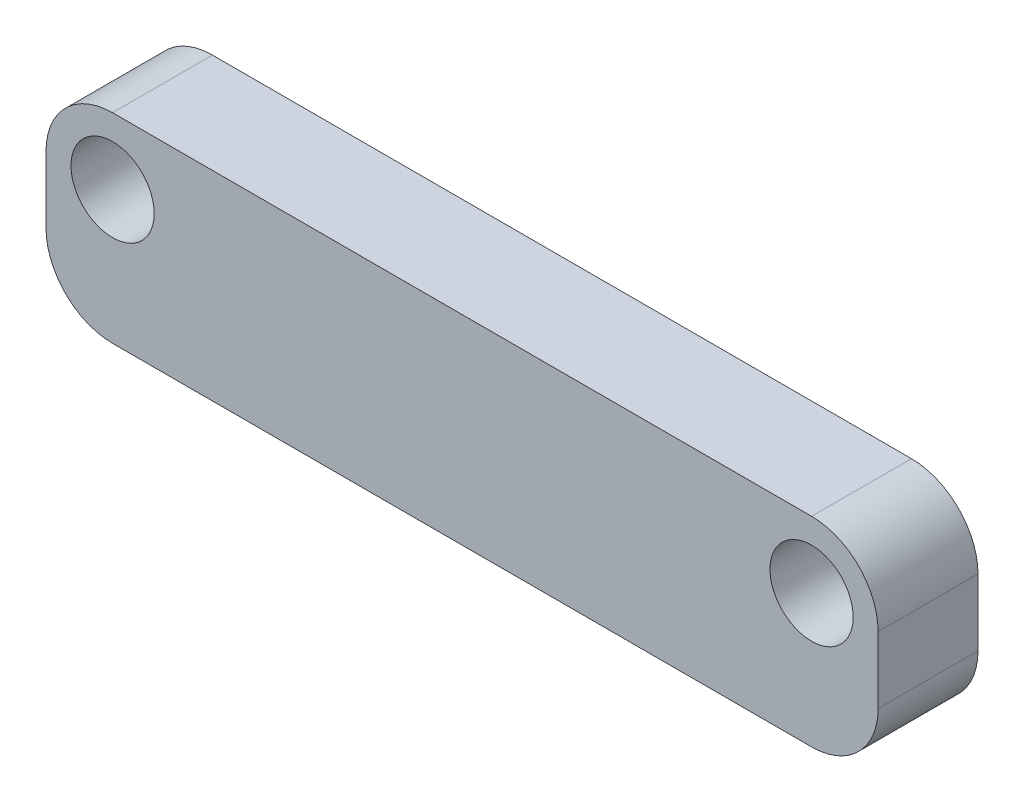
ISO-10303-21;
HEADER;
FILE_DESCRIPTION(('STEP AP214'),'2;1');
FILE_NAME('part.step','',(''),(''),'','','');
FILE_SCHEMA(('AUTOMOTIVE_DESIGN { 1 0 10303 214 1 1 1 1 }'));
ENDSEC;
DATA;
#1=APPLICATION_CONTEXT('core data for automotive mechanical design processes');
#2=APPLICATION_PROTOCOL_DEFINITION('international standard','automotive_design',2000,#1);
#3=PRODUCT_CONTEXT('',#1,'mechanical');
#4=PRODUCT('Part','Part','',(#3));
#5=PRODUCT_RELATED_PRODUCT_CATEGORY('part','',(#4));
#6=PRODUCT_DEFINITION_FORMATION('','',#4);
#7=PRODUCT_DEFINITION_CONTEXT('part definition',#1,'design');
#8=PRODUCT_DEFINITION('design','',#6,#7);
#9=PRODUCT_DEFINITION_SHAPE('','',#8);
#10=(LENGTH_UNIT() NAMED_UNIT(*) SI_UNIT(.MILLI.,.METRE.));
#11=(NAMED_UNIT(*) PLANE_ANGLE_UNIT() SI_UNIT($,.RADIAN.));
#12=(NAMED_UNIT(*) SI_UNIT($,.STERADIAN.) SOLID_ANGLE_UNIT());
#13=UNCERTAINTY_MEASURE_WITH_UNIT(LENGTH_MEASURE(1.E-05),#10,'distance_accuracy_value','');
#14=(GEOMETRIC_REPRESENTATION_CONTEXT(3) GLOBAL_UNCERTAINTY_ASSIGNED_CONTEXT((#13)) GLOBAL_UNIT_ASSIGNED_CONTEXT((#10,
#11,#12)) REPRESENTATION_CONTEXT('',''));
#15=CARTESIAN_POINT('',(0.,0.,0.));
#16=DIRECTION('',(0.,0.,1.));
#17=DIRECTION('',(1.,0.,0.));
#18=AXIS2_PLACEMENT_3D('',#15,#16,#17);
#19=CARTESIAN_POINT('',(21.,-2.,6.));
#20=DIRECTION('',(0.,0.,1.));
#21=DIRECTION('',(1.,0.,0.));
#22=AXIS2_PLACEMENT_3D('',#19,#20,#21);
#23=PLANE('',#22);
#24=CARTESIAN_POINT('',(-21.,2.,6.));
#25=DIRECTION('',(0.,0.,1.));
#26=DIRECTION('',(1.,0.,0.));
#27=AXIS2_PLACEMENT_3D('',#24,#25,#26);
#28=CIRCLE('',#27,2.5);
#29=CARTESIAN_POINT('',(-18.5,2.,6.));
#30=VERTEX_POINT('',#29);
#31=EDGE_CURVE('E140',#30,#30,#28,.T.);
#32=ORIENTED_EDGE('',*,*,#31,.F.);
#33=EDGE_LOOP('',(#32));
#34=FACE_BOUND('',#33,.T.);
#35=CARTESIAN_POINT('',(21.,-2.,6.));
#36=DIRECTION('',(0.,0.,1.));
#37=DIRECTION('',(1.,0.,0.));
#38=AXIS2_PLACEMENT_3D('',#35,#36,#37);
#39=CIRCLE('',#38,4.);
#40=CARTESIAN_POINT('',(21.,-6.,6.));
#41=VERTEX_POINT('',#40);
#42=CARTESIAN_POINT('',(25.,-1.99999999999997,6.));
#43=VERTEX_POINT('',#42);
#44=EDGE_CURVE('E151',#41,#43,#39,.T.);
#45=ORIENTED_EDGE('',*,*,#44,.T.);
#46=DIRECTION('',(0.,1.,0.));
#47=VECTOR('',#46,1.);
#48=CARTESIAN_POINT('',(25.,1.99999999999997,6.));
#49=LINE('',#48,#47);
#50=CARTESIAN_POINT('',(25.,1.99999999999997,6.));
#51=VERTEX_POINT('',#50);
#52=EDGE_CURVE('E99',#43,#51,#49,.T.);
#53=ORIENTED_EDGE('',*,*,#52,.T.);
#54=CARTESIAN_POINT('',(21.,2.,6.));
#55=DIRECTION('',(0.,0.,1.));
#56=DIRECTION('',(-1.,0.,0.));
#57=AXIS2_PLACEMENT_3D('',#54,#55,#56);
#58=CIRCLE('',#57,4.);
#59=CARTESIAN_POINT('',(21.,6.,6.));
#60=VERTEX_POINT('',#59);
#61=EDGE_CURVE('E166',#51,#60,#58,.T.);
#62=ORIENTED_EDGE('',*,*,#61,.T.);
#63=DIRECTION('',(-1.,0.,0.));
#64=VECTOR('',#63,1.);
#65=CARTESIAN_POINT('',(-21.,6.,6.));
#66=LINE('',#65,#64);
#67=CARTESIAN_POINT('',(-21.,6.,6.));
#68=VERTEX_POINT('',#67);
#69=EDGE_CURVE('E179',#60,#68,#66,.T.);
#70=ORIENTED_EDGE('',*,*,#69,.T.);
#71=CARTESIAN_POINT('',(-21.,2.,6.));
#72=DIRECTION('',(0.,0.,1.));
#73=DIRECTION('',(1.,0.,0.));
#74=AXIS2_PLACEMENT_3D('',#71,#72,#73);
#75=CIRCLE('',#74,4.);
#76=CARTESIAN_POINT('',(-25.,1.99999999999997,6.));
#77=VERTEX_POINT('',#76);
#78=EDGE_CURVE('E118',#68,#77,#75,.T.);
#79=ORIENTED_EDGE('',*,*,#78,.T.);
#80=DIRECTION('',(0.,-1.,0.));
#81=VECTOR('',#80,1.);
#82=CARTESIAN_POINT('',(-25.,1.99999999999997,6.));
#83=LINE('',#82,#81);
#84=CARTESIAN_POINT('',(-25.,-1.99999999999997,6.));
#85=VERTEX_POINT('',#84);
#86=EDGE_CURVE('E112',#77,#85,#83,.T.);
#87=ORIENTED_EDGE('',*,*,#86,.T.);
#88=CARTESIAN_POINT('',(-21.,-2.,6.));
#89=DIRECTION('',(0.,0.,1.));
#90=DIRECTION('',(1.,0.,0.));
#91=AXIS2_PLACEMENT_3D('',#88,#89,#90);
#92=CIRCLE('',#91,4.);
#93=CARTESIAN_POINT('',(-21.,-6.,6.));
#94=VERTEX_POINT('',#93);
#95=EDGE_CURVE('E116',#85,#94,#92,.T.);
#96=ORIENTED_EDGE('',*,*,#95,.T.);
#97=DIRECTION('',(1.,0.,0.));
#98=VECTOR('',#97,1.);
#99=CARTESIAN_POINT('',(-21.,-6.,6.));
#100=LINE('',#99,#98);
#101=EDGE_CURVE('E56',#94,#41,#100,.T.);
#102=ORIENTED_EDGE('',*,*,#101,.T.);
#103=EDGE_LOOP('',(#45,#53,#62,#70,#79,#87,#96,#102));
#104=FACE_BOUND('',#103,.T.);
#105=CARTESIAN_POINT('',(21.,2.,6.));
#106=DIRECTION('',(0.,0.,1.));
#107=DIRECTION('',(1.,0.,0.));
#108=AXIS2_PLACEMENT_3D('',#105,#106,#107);
#109=CIRCLE('',#108,2.5);
#110=CARTESIAN_POINT('',(23.5,2.,6.));
#111=VERTEX_POINT('',#110);
#112=EDGE_CURVE('E188',#111,#111,#109,.T.);
#113=ORIENTED_EDGE('',*,*,#112,.F.);
#114=EDGE_LOOP('',(#113));
#115=FACE_BOUND('',#114,.T.);
#116=ADVANCED_FACE('F39',(#34,#104,#115),#23,.T.);
#117=CARTESIAN_POINT('',(21.,-2.,0.));
#118=DIRECTION('',(0.,0.,1.));
#119=DIRECTION('',(1.,0.,0.));
#120=AXIS2_PLACEMENT_3D('',#117,#118,#119);
#121=PLANE('',#120);
#122=CARTESIAN_POINT('',(21.,-2.,0.));
#123=DIRECTION('',(0.,0.,1.));
#124=DIRECTION('',(1.,0.,0.));
#125=AXIS2_PLACEMENT_3D('',#122,#123,#124);
#126=CIRCLE('',#125,4.);
#127=CARTESIAN_POINT('',(21.,-6.,0.));
#128=VERTEX_POINT('',#127);
#129=CARTESIAN_POINT('',(25.,-1.99999999999997,0.));
#130=VERTEX_POINT('',#129);
#131=EDGE_CURVE('E136',#128,#130,#126,.T.);
#132=ORIENTED_EDGE('',*,*,#131,.F.);
#133=DIRECTION('',(1.,0.,0.));
#134=VECTOR('',#133,1.);
#135=CARTESIAN_POINT('',(-21.,-6.,0.));
#136=LINE('',#135,#134);
#137=CARTESIAN_POINT('',(-21.,-6.,0.));
#138=VERTEX_POINT('',#137);
#139=EDGE_CURVE('E91',#138,#128,#136,.T.);
#140=ORIENTED_EDGE('',*,*,#139,.F.);
#141=CARTESIAN_POINT('',(-21.,-2.,0.));
#142=DIRECTION('',(0.,0.,1.));
#143=DIRECTION('',(1.,0.,0.));
#144=AXIS2_PLACEMENT_3D('',#141,#142,#143);
#145=CIRCLE('',#144,4.);
#146=CARTESIAN_POINT('',(-25.,-1.99999999999997,0.));
#147=VERTEX_POINT('',#146);
#148=EDGE_CURVE('E85',#147,#138,#145,.T.);
#149=ORIENTED_EDGE('',*,*,#148,.F.);
#150=DIRECTION('',(0.,-1.,0.));
#151=VECTOR('',#150,1.);
#152=CARTESIAN_POINT('',(-25.,1.99999999999997,0.));
#153=LINE('',#152,#151);
#154=CARTESIAN_POINT('',(-25.,1.99999999999997,0.));
#155=VERTEX_POINT('',#154);
#156=EDGE_CURVE('E126',#155,#147,#153,.T.);
#157=ORIENTED_EDGE('',*,*,#156,.F.);
#158=CARTESIAN_POINT('',(-21.,2.,0.));
#159=DIRECTION('',(0.,0.,1.));
#160=DIRECTION('',(1.,0.,0.));
#161=AXIS2_PLACEMENT_3D('',#158,#159,#160);
#162=CIRCLE('',#161,4.);
#163=CARTESIAN_POINT('',(-21.,6.,0.));
#164=VERTEX_POINT('',#163);
#165=EDGE_CURVE('E146',#164,#155,#162,.T.);
#166=ORIENTED_EDGE('',*,*,#165,.F.);
#167=DIRECTION('',(-1.,0.,0.));
#168=VECTOR('',#167,1.);
#169=CARTESIAN_POINT('',(-21.,6.,0.));
#170=LINE('',#169,#168);
#171=CARTESIAN_POINT('',(21.,6.,0.));
#172=VERTEX_POINT('',#171);
#173=EDGE_CURVE('E144',#172,#164,#170,.T.);
#174=ORIENTED_EDGE('',*,*,#173,.F.);
#175=CARTESIAN_POINT('',(21.,2.,0.));
#176=DIRECTION('',(0.,0.,1.));
#177=DIRECTION('',(-1.,0.,0.));
#178=AXIS2_PLACEMENT_3D('',#175,#176,#177);
#179=CIRCLE('',#178,4.);
#180=CARTESIAN_POINT('',(25.,1.99999999999997,0.));
#181=VERTEX_POINT('',#180);
#182=EDGE_CURVE('E142',#181,#172,#179,.T.);
#183=ORIENTED_EDGE('',*,*,#182,.F.);
#184=DIRECTION('',(0.,1.,0.));
#185=VECTOR('',#184,1.);
#186=CARTESIAN_POINT('',(25.,1.99999999999997,0.));
#187=LINE('',#186,#185);
#188=EDGE_CURVE('E139',#130,#181,#187,.T.);
#189=ORIENTED_EDGE('',*,*,#188,.F.);
#190=EDGE_LOOP('',(#132,#140,#149,#157,#166,#174,#183,#189));
#191=FACE_BOUND('',#190,.T.);
#192=CARTESIAN_POINT('',(-21.,2.,0.));
#193=DIRECTION('',(0.,0.,1.));
#194=DIRECTION('',(1.,0.,0.));
#195=AXIS2_PLACEMENT_3D('',#192,#193,#194);
#196=CIRCLE('',#195,2.5);
#197=CARTESIAN_POINT('',(-18.5,2.,0.));
#198=VERTEX_POINT('',#197);
#199=EDGE_CURVE('E185',#198,#198,#196,.T.);
#200=ORIENTED_EDGE('',*,*,#199,.T.);
#201=EDGE_LOOP('',(#200));
#202=FACE_BOUND('',#201,.T.);
#203=CARTESIAN_POINT('',(21.,2.,0.));
#204=DIRECTION('',(0.,0.,1.));
#205=DIRECTION('',(1.,0.,0.));
#206=AXIS2_PLACEMENT_3D('',#203,#204,#205);
#207=CIRCLE('',#206,2.5);
#208=CARTESIAN_POINT('',(23.5,2.,0.));
#209=VERTEX_POINT('',#208);
#210=EDGE_CURVE('E191',#209,#209,#207,.T.);
#211=ORIENTED_EDGE('',*,*,#210,.T.);
#212=EDGE_LOOP('',(#211));
#213=FACE_BOUND('',#212,.T.);
#214=ADVANCED_FACE('F170',(#191,#202,#213),#121,.F.);
#215=CARTESIAN_POINT('',(21.,-2.,6.));
#216=DIRECTION('',(0.,0.,-1.));
#217=DIRECTION('',(-1.,0.,0.));
#218=AXIS2_PLACEMENT_3D('',#215,#216,#217);
#219=CYLINDRICAL_SURFACE('',#218,4.);
#220=ORIENTED_EDGE('',*,*,#131,.T.);
#221=DIRECTION('',(0.,0.,-1.));
#222=VECTOR('',#221,1.);
#223=CARTESIAN_POINT('',(25.,-1.99999999999997,6.));
#224=LINE('',#223,#222);
#225=EDGE_CURVE('E11',#43,#130,#224,.T.);
#226=ORIENTED_EDGE('',*,*,#225,.F.);
#227=ORIENTED_EDGE('',*,*,#44,.F.);
#228=DIRECTION('',(0.,0.,-1.));
#229=VECTOR('',#228,1.);
#230=CARTESIAN_POINT('',(21.,-6.,6.));
#231=LINE('',#230,#229);
#232=EDGE_CURVE('E132',#41,#128,#231,.T.);
#233=ORIENTED_EDGE('',*,*,#232,.T.);
#234=EDGE_LOOP('',(#220,#226,#227,#233));
#235=FACE_BOUND('',#234,.T.);
#236=ADVANCED_FACE('F41',(#235),#219,.T.);
#237=CARTESIAN_POINT('',(25.,1.99999999999997,6.));
#238=DIRECTION('',(-1.,0.,0.));
#239=DIRECTION('',(0.,0.,1.));
#240=AXIS2_PLACEMENT_3D('',#237,#238,#239);
#241=PLANE('',#240);
#242=ORIENTED_EDGE('',*,*,#188,.T.);
#243=DIRECTION('',(0.,0.,-1.));
#244=VECTOR('',#243,1.);
#245=CARTESIAN_POINT('',(25.,1.99999999999997,6.));
#246=LINE('',#245,#244);
#247=EDGE_CURVE('E48',#51,#181,#246,.T.);
#248=ORIENTED_EDGE('',*,*,#247,.F.);
#249=ORIENTED_EDGE('',*,*,#52,.F.);
#250=ORIENTED_EDGE('',*,*,#225,.T.);
#251=EDGE_LOOP('',(#242,#248,#249,#250));
#252=FACE_BOUND('',#251,.T.);
#253=ADVANCED_FACE('F223',(#252),#241,.F.);
#254=CARTESIAN_POINT('',(21.,2.,6.));
#255=DIRECTION('',(0.,0.,-1.));
#256=DIRECTION('',(-1.,0.,0.));
#257=AXIS2_PLACEMENT_3D('',#254,#255,#256);
#258=CYLINDRICAL_SURFACE('',#257,4.);
#259=ORIENTED_EDGE('',*,*,#182,.T.);
#260=DIRECTION('',(0.,0.,-1.));
#261=VECTOR('',#260,1.);
#262=CARTESIAN_POINT('',(21.,6.,6.));
#263=LINE('',#262,#261);
#264=EDGE_CURVE('E158',#60,#172,#263,.T.);
#265=ORIENTED_EDGE('',*,*,#264,.F.);
#266=ORIENTED_EDGE('',*,*,#61,.F.);
#267=ORIENTED_EDGE('',*,*,#247,.T.);
#268=EDGE_LOOP('',(#259,#265,#266,#267));
#269=FACE_BOUND('',#268,.T.);
#270=ADVANCED_FACE('F164',(#269),#258,.T.);
#271=CARTESIAN_POINT('',(-21.,6.,6.));
#272=DIRECTION('',(0.,-1.,0.));
#273=DIRECTION('',(0.,0.,-1.));
#274=AXIS2_PLACEMENT_3D('',#271,#272,#273);
#275=PLANE('',#274);
#276=ORIENTED_EDGE('',*,*,#173,.T.);
#277=DIRECTION('',(0.,0.,-1.));
#278=VECTOR('',#277,1.);
#279=CARTESIAN_POINT('',(-21.,6.,6.));
#280=LINE('',#279,#278);
#281=EDGE_CURVE('E155',#68,#164,#280,.T.);
#282=ORIENTED_EDGE('',*,*,#281,.F.);
#283=ORIENTED_EDGE('',*,*,#69,.F.);
#284=ORIENTED_EDGE('',*,*,#264,.T.);
#285=EDGE_LOOP('',(#276,#282,#283,#284));
#286=FACE_BOUND('',#285,.T.);
#287=ADVANCED_FACE('F175',(#286),#275,.F.);
#288=CARTESIAN_POINT('',(-21.,2.,6.));
#289=DIRECTION('',(0.,0.,-1.));
#290=DIRECTION('',(-1.,0.,0.));
#291=AXIS2_PLACEMENT_3D('',#288,#289,#290);
#292=CYLINDRICAL_SURFACE('',#291,4.);
#293=ORIENTED_EDGE('',*,*,#165,.T.);
#294=DIRECTION('',(0.,0.,-1.));
#295=VECTOR('',#294,1.);
#296=CARTESIAN_POINT('',(-25.,1.99999999999997,6.));
#297=LINE('',#296,#295);
#298=EDGE_CURVE('E127',#77,#155,#297,.T.);
#299=ORIENTED_EDGE('',*,*,#298,.F.);
#300=ORIENTED_EDGE('',*,*,#78,.F.);
#301=ORIENTED_EDGE('',*,*,#281,.T.);
#302=EDGE_LOOP('',(#293,#299,#300,#301));
#303=FACE_BOUND('',#302,.T.);
#304=ADVANCED_FACE('F178',(#303),#292,.T.);
#305=CARTESIAN_POINT('',(-25.,1.99999999999997,6.));
#306=DIRECTION('',(1.,0.,0.));
#307=DIRECTION('',(0.,0.,-1.));
#308=AXIS2_PLACEMENT_3D('',#305,#306,#307);
#309=PLANE('',#308);
#310=ORIENTED_EDGE('',*,*,#156,.T.);
#311=DIRECTION('',(0.,0.,-1.));
#312=VECTOR('',#311,1.);
#313=CARTESIAN_POINT('',(-25.,-1.99999999999997,6.));
#314=LINE('',#313,#312);
#315=EDGE_CURVE('E123',#85,#147,#314,.T.);
#316=ORIENTED_EDGE('',*,*,#315,.F.);
#317=ORIENTED_EDGE('',*,*,#86,.F.);
#318=ORIENTED_EDGE('',*,*,#298,.T.);
#319=EDGE_LOOP('',(#310,#316,#317,#318));
#320=FACE_BOUND('',#319,.T.);
#321=ADVANCED_FACE('F124',(#320),#309,.F.);
#322=CARTESIAN_POINT('',(-21.,-2.,6.));
#323=DIRECTION('',(0.,0.,-1.));
#324=DIRECTION('',(-1.,0.,0.));
#325=AXIS2_PLACEMENT_3D('',#322,#323,#324);
#326=CYLINDRICAL_SURFACE('',#325,4.);
#327=ORIENTED_EDGE('',*,*,#148,.T.);
#328=DIRECTION('',(0.,0.,-1.));
#329=VECTOR('',#328,1.);
#330=CARTESIAN_POINT('',(-21.,-6.,6.));
#331=LINE('',#330,#329);
#332=EDGE_CURVE('E128',#94,#138,#331,.T.);
#333=ORIENTED_EDGE('',*,*,#332,.F.);
#334=ORIENTED_EDGE('',*,*,#95,.F.);
#335=ORIENTED_EDGE('',*,*,#315,.T.);
#336=EDGE_LOOP('',(#327,#333,#334,#335));
#337=FACE_BOUND('',#336,.T.);
#338=ADVANCED_FACE('F130',(#337),#326,.T.);
#339=CARTESIAN_POINT('',(-21.,-6.,6.));
#340=DIRECTION('',(0.,1.,0.));
#341=DIRECTION('',(0.,0.,1.));
#342=AXIS2_PLACEMENT_3D('',#339,#340,#341);
#343=PLANE('',#342);
#344=ORIENTED_EDGE('',*,*,#139,.T.);
#345=ORIENTED_EDGE('',*,*,#232,.F.);
#346=ORIENTED_EDGE('',*,*,#101,.F.);
#347=ORIENTED_EDGE('',*,*,#332,.T.);
#348=EDGE_LOOP('',(#344,#345,#346,#347));
#349=FACE_BOUND('',#348,.T.);
#350=ADVANCED_FACE('F211',(#349),#343,.F.);
#351=CARTESIAN_POINT('',(-21.,2.,6.));
#352=DIRECTION('',(0.,0.,-1.));
#353=DIRECTION('',(-1.,0.,0.));
#354=AXIS2_PLACEMENT_3D('',#351,#352,#353);
#355=CYLINDRICAL_SURFACE('',#354,2.5);
#356=ORIENTED_EDGE('',*,*,#31,.T.);
#357=EDGE_LOOP('',(#356));
#358=FACE_BOUND('',#357,.T.);
#359=ORIENTED_EDGE('',*,*,#199,.F.);
#360=EDGE_LOOP('',(#359));
#361=FACE_BOUND('',#360,.T.);
#362=ADVANCED_FACE('F208',(#358,#361),#355,.F.);
#363=CARTESIAN_POINT('',(21.,2.,6.));
#364=DIRECTION('',(0.,0.,-1.));
#365=DIRECTION('',(-1.,0.,0.));
#366=AXIS2_PLACEMENT_3D('',#363,#364,#365);
#367=CYLINDRICAL_SURFACE('',#366,2.5);
#368=ORIENTED_EDGE('',*,*,#112,.T.);
#369=EDGE_LOOP('',(#368));
#370=FACE_BOUND('',#369,.T.);
#371=ORIENTED_EDGE('',*,*,#210,.F.);
#372=EDGE_LOOP('',(#371));
#373=FACE_BOUND('',#372,.T.);
#374=ADVANCED_FACE('F197',(#370,#373),#367,.F.);
#375=CLOSED_SHELL('',(#116,#214,#236,#253,#270,#287,#304,#321,#338,#350,#362,#374));
#376=MANIFOLD_SOLID_BREP('B2',#375);
#377=ADVANCED_BREP_SHAPE_REPRESENTATION('',(#18,#376),#14);
#378=SHAPE_DEFINITION_REPRESENTATION(#9,#377);
ENDSEC;
END-ISO-10303-21;
